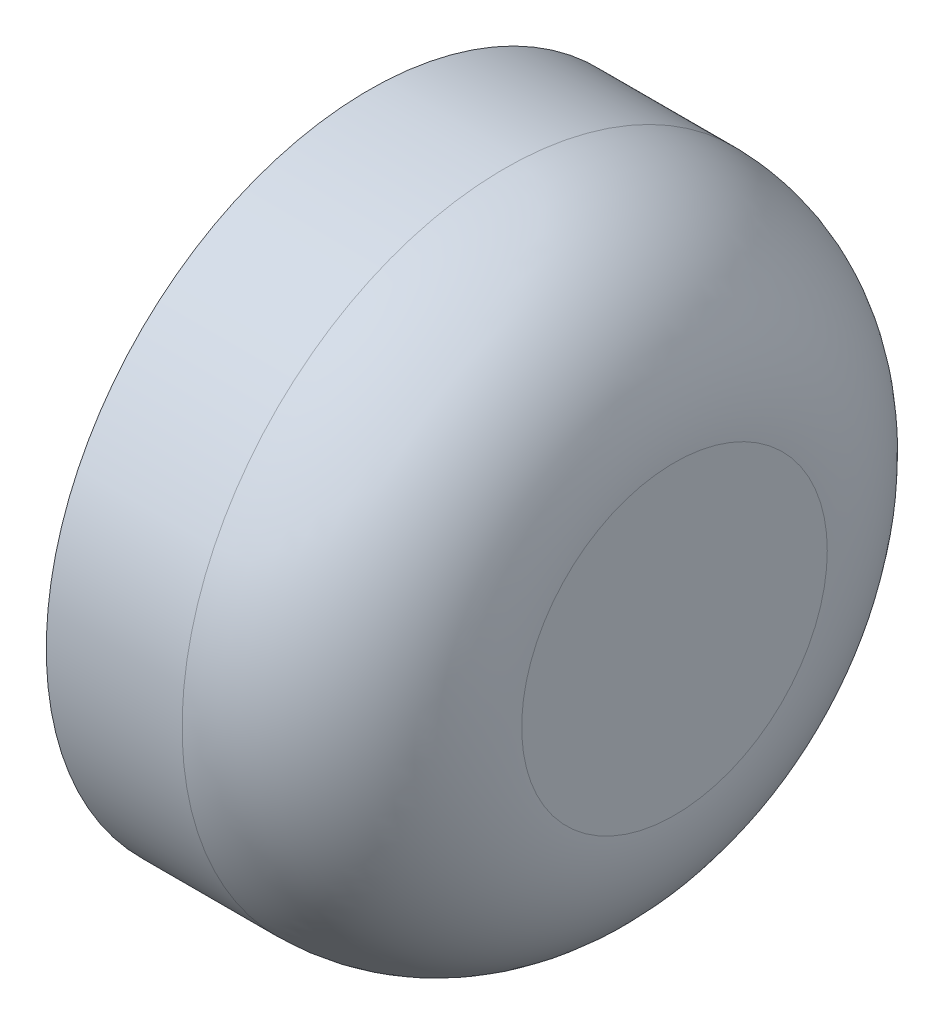
ISO-10303-21;
HEADER;
FILE_DESCRIPTION(('STEP AP214'),'2;1');
FILE_NAME('part.step','',(''),(''),'','','');
FILE_SCHEMA(('AUTOMOTIVE_DESIGN { 1 0 10303 214 1 1 1 1 }'));
ENDSEC;
DATA;
#1=APPLICATION_CONTEXT('core data for automotive mechanical design processes');
#2=APPLICATION_PROTOCOL_DEFINITION('international standard','automotive_design',2000,#1);
#3=PRODUCT_CONTEXT('',#1,'mechanical');
#4=PRODUCT('Part','Part','',(#3));
#5=PRODUCT_RELATED_PRODUCT_CATEGORY('part','',(#4));
#6=PRODUCT_DEFINITION_FORMATION('','',#4);
#7=PRODUCT_DEFINITION_CONTEXT('part definition',#1,'design');
#8=PRODUCT_DEFINITION('design','',#6,#7);
#9=PRODUCT_DEFINITION_SHAPE('','',#8);
#10=(LENGTH_UNIT() NAMED_UNIT(*) SI_UNIT(.MILLI.,.METRE.));
#11=(NAMED_UNIT(*) PLANE_ANGLE_UNIT() SI_UNIT($,.RADIAN.));
#12=(NAMED_UNIT(*) SI_UNIT($,.STERADIAN.) SOLID_ANGLE_UNIT());
#13=UNCERTAINTY_MEASURE_WITH_UNIT(LENGTH_MEASURE(1.E-05),#10,'distance_accuracy_value','');
#14=(GEOMETRIC_REPRESENTATION_CONTEXT(3) GLOBAL_UNCERTAINTY_ASSIGNED_CONTEXT((#13)) GLOBAL_UNIT_ASSIGNED_CONTEXT((#10,
#11,#12)) REPRESENTATION_CONTEXT('',''));
#15=CARTESIAN_POINT('',(0.,0.,0.));
#16=DIRECTION('',(0.,0.,1.));
#17=DIRECTION('',(1.,0.,0.));
#18=AXIS2_PLACEMENT_3D('',#15,#16,#17);
#19=CARTESIAN_POINT('',(4.5,0.0284357917365587,-0.107293897250071));
#20=DIRECTION('',(-1.,0.,0.));
#21=DIRECTION('',(0.,0.,1.));
#22=AXIS2_PLACEMENT_3D('',#19,#20,#21);
#23=CYLINDRICAL_SURFACE('',#22,4.75);
#24=CARTESIAN_POINT('',(2.,0.0284357917365587,-0.107293897250071));
#25=DIRECTION('',(1.,0.,0.));
#26=DIRECTION('',(0.,0.,-1.));
#27=AXIS2_PLACEMENT_3D('',#24,#25,#26);
#28=CIRCLE('',#27,4.75);
#29=CARTESIAN_POINT('',(2.,0.0284357917365587,-4.85729389725007));
#30=VERTEX_POINT('',#29);
#31=EDGE_CURVE('E10',#30,#30,#28,.F.);
#32=ORIENTED_EDGE('',*,*,#31,.T.);
#33=EDGE_LOOP('',(#32));
#34=FACE_BOUND('',#33,.T.);
#35=CARTESIAN_POINT('',(0.,0.0284357917365587,-0.107293897250071));
#36=DIRECTION('',(1.,0.,0.));
#37=DIRECTION('',(0.,0.,-1.));
#38=AXIS2_PLACEMENT_3D('',#35,#36,#37);
#39=CIRCLE('',#38,4.75);
#40=CARTESIAN_POINT('',(0.,0.0284357917365587,-4.85729389725007));
#41=VERTEX_POINT('',#40);
#42=EDGE_CURVE('E50',#41,#41,#39,.T.);
#43=ORIENTED_EDGE('',*,*,#42,.T.);
#44=EDGE_LOOP('',(#43));
#45=FACE_BOUND('',#44,.T.);
#46=ADVANCED_FACE('F37',(#34,#45),#23,.T.);
#47=CARTESIAN_POINT('',(4.5,0.0284357917365587,-0.107293897250071));
#48=DIRECTION('',(1.,0.,0.));
#49=DIRECTION('',(0.,0.,-1.));
#50=AXIS2_PLACEMENT_3D('',#47,#48,#49);
#51=PLANE('',#50);
#52=CARTESIAN_POINT('',(4.5,0.0284357917365587,-0.107293897250071));
#53=DIRECTION('',(1.,0.,0.));
#54=DIRECTION('',(0.,0.,-1.));
#55=AXIS2_PLACEMENT_3D('',#52,#53,#54);
#56=CIRCLE('',#55,2.25);
#57=CARTESIAN_POINT('',(4.5,0.0284357917365587,-2.35729389725007));
#58=VERTEX_POINT('',#57);
#59=EDGE_CURVE('E45',#58,#58,#56,.T.);
#60=ORIENTED_EDGE('',*,*,#59,.T.);
#61=EDGE_LOOP('',(#60));
#62=FACE_BOUND('',#61,.T.);
#63=ADVANCED_FACE('F77',(#62),#51,.T.);
#64=CARTESIAN_POINT('',(0.,0.0284357917365587,-0.107293897250071));
#65=DIRECTION('',(1.,0.,0.));
#66=DIRECTION('',(0.,0.,-1.));
#67=AXIS2_PLACEMENT_3D('',#64,#65,#66);
#68=PLANE('',#67);
#69=CARTESIAN_POINT('',(0.,0.,0.));
#70=DIRECTION('',(-1.,0.,0.));
#71=DIRECTION('',(0.,0.,1.));
#72=AXIS2_PLACEMENT_3D('',#69,#70,#71);
#73=CIRCLE('',#72,3.3);
#74=CARTESIAN_POINT('',(0.,0.,3.3));
#75=VERTEX_POINT('',#74);
#76=EDGE_CURVE('E58',#75,#75,#73,.T.);
#77=ORIENTED_EDGE('',*,*,#76,.F.);
#78=EDGE_LOOP('',(#77));
#79=FACE_BOUND('',#78,.T.);
#80=ORIENTED_EDGE('',*,*,#42,.F.);
#81=EDGE_LOOP('',(#80));
#82=FACE_BOUND('',#81,.T.);
#83=ADVANCED_FACE('F74',(#79,#82),#68,.F.);
#84=CARTESIAN_POINT('',(2.,0.0284357917365587,-0.107293897250071));
#85=DIRECTION('',(1.,0.,0.));
#86=DIRECTION('',(0.,0.,-1.));
#87=AXIS2_PLACEMENT_3D('',#84,#85,#86);
#88=DEGENERATE_TOROIDAL_SURFACE('',#87,2.25,2.5,.T.);
#89=ORIENTED_EDGE('',*,*,#31,.F.);
#90=EDGE_LOOP('',(#89));
#91=FACE_BOUND('',#90,.T.);
#92=ORIENTED_EDGE('',*,*,#59,.F.);
#93=EDGE_LOOP('',(#92));
#94=FACE_BOUND('',#93,.T.);
#95=ADVANCED_FACE('F39',(#91,#94),#88,.T.);
#96=CARTESIAN_POINT('',(1.,0.,0.));
#97=DIRECTION('',(-1.,0.,0.));
#98=DIRECTION('',(0.,0.,1.));
#99=AXIS2_PLACEMENT_3D('',#96,#97,#98);
#100=CYLINDRICAL_SURFACE('',#99,3.3);
#101=CARTESIAN_POINT('',(1.,0.,0.));
#102=DIRECTION('',(-1.,0.,0.));
#103=DIRECTION('',(0.,0.,1.));
#104=AXIS2_PLACEMENT_3D('',#101,#102,#103);
#105=CIRCLE('',#104,3.3);
#106=CARTESIAN_POINT('',(1.,0.,3.3));
#107=VERTEX_POINT('',#106);
#108=EDGE_CURVE('E55',#107,#107,#105,.T.);
#109=ORIENTED_EDGE('',*,*,#108,.F.);
#110=EDGE_LOOP('',(#109));
#111=FACE_BOUND('',#110,.T.);
#112=ORIENTED_EDGE('',*,*,#76,.T.);
#113=EDGE_LOOP('',(#112));
#114=FACE_BOUND('',#113,.T.);
#115=ADVANCED_FACE('F68',(#111,#114),#100,.F.);
#116=CARTESIAN_POINT('',(1.,0.,0.));
#117=DIRECTION('',(-1.,0.,0.));
#118=DIRECTION('',(0.,0.,1.));
#119=AXIS2_PLACEMENT_3D('',#116,#117,#118);
#120=PLANE('',#119);
#121=ORIENTED_EDGE('',*,*,#108,.T.);
#122=EDGE_LOOP('',(#121));
#123=FACE_BOUND('',#122,.T.);
#124=ADVANCED_FACE('F66',(#123),#120,.T.);
#125=CLOSED_SHELL('',(#46,#63,#83,#95,#115,#124));
#126=MANIFOLD_SOLID_BREP('B2',#125);
#127=ADVANCED_BREP_SHAPE_REPRESENTATION('',(#18,#126),#14);
#128=SHAPE_DEFINITION_REPRESENTATION(#9,#127);
ENDSEC;
END-ISO-10303-21;
